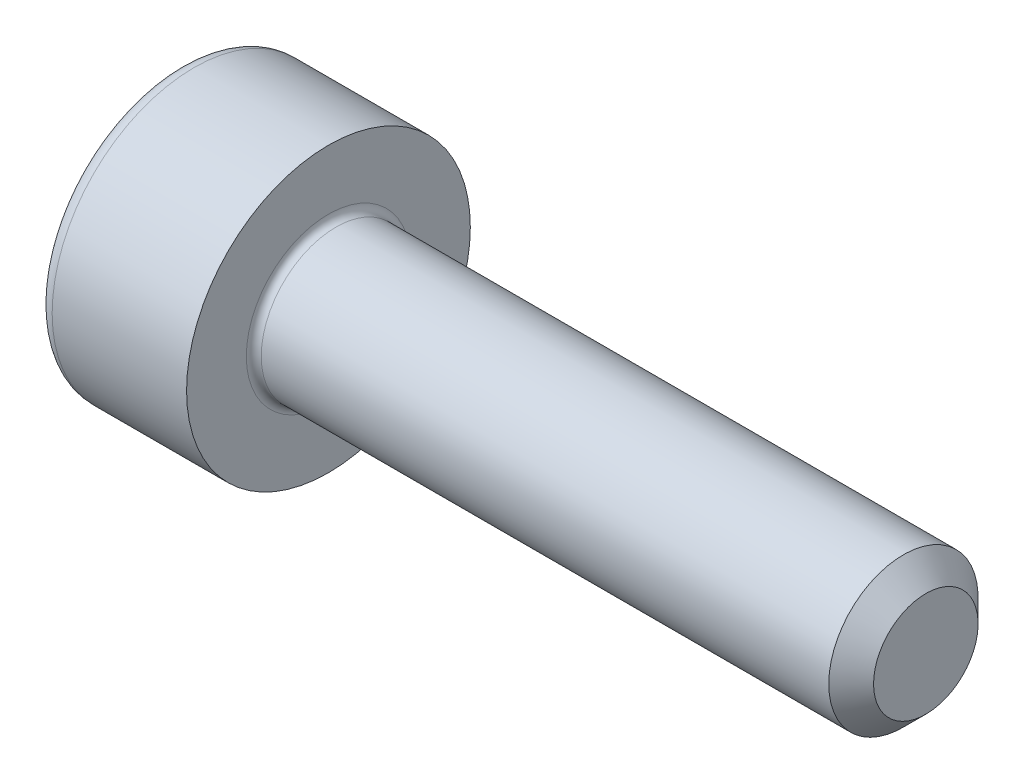
ISO-10303-21;
HEADER;
FILE_DESCRIPTION(('STEP AP214'),'2;1');
FILE_NAME('part.step','',(''),(''),'','','');
FILE_SCHEMA(('AUTOMOTIVE_DESIGN { 1 0 10303 214 1 1 1 1 }'));
ENDSEC;
DATA;
#1=APPLICATION_CONTEXT('core data for automotive mechanical design processes');
#2=APPLICATION_PROTOCOL_DEFINITION('international standard','automotive_design',2000,#1);
#3=PRODUCT_CONTEXT('',#1,'mechanical');
#4=PRODUCT('Part','Part','',(#3));
#5=PRODUCT_RELATED_PRODUCT_CATEGORY('part','',(#4));
#6=PRODUCT_DEFINITION_FORMATION('','',#4);
#7=PRODUCT_DEFINITION_CONTEXT('part definition',#1,'design');
#8=PRODUCT_DEFINITION('design','',#6,#7);
#9=PRODUCT_DEFINITION_SHAPE('','',#8);
#10=(LENGTH_UNIT() NAMED_UNIT(*) SI_UNIT(.MILLI.,.METRE.));
#11=(NAMED_UNIT(*) PLANE_ANGLE_UNIT() SI_UNIT($,.RADIAN.));
#12=(NAMED_UNIT(*) SI_UNIT($,.STERADIAN.) SOLID_ANGLE_UNIT());
#13=UNCERTAINTY_MEASURE_WITH_UNIT(LENGTH_MEASURE(1.E-05),#10,'distance_accuracy_value','');
#14=(GEOMETRIC_REPRESENTATION_CONTEXT(3) GLOBAL_UNCERTAINTY_ASSIGNED_CONTEXT((#13)) GLOBAL_UNIT_ASSIGNED_CONTEXT((#10,
#11,#12)) REPRESENTATION_CONTEXT('',''));
#15=CARTESIAN_POINT('',(0.,0.,0.));
#16=DIRECTION('',(0.,0.,1.));
#17=DIRECTION('',(1.,0.,0.));
#18=AXIS2_PLACEMENT_3D('',#15,#16,#17);
#19=CARTESIAN_POINT('',(-2.,0.,0.));
#20=DIRECTION('',(-1.,0.,0.));
#21=DIRECTION('',(0.,1.,0.));
#22=AXIS2_PLACEMENT_3D('',#19,#20,#21);
#23=PLANE('',#22);
#24=CARTESIAN_POINT('',(-2.,0.,0.));
#25=DIRECTION('',(1.,0.,0.));
#26=DIRECTION('',(0.,1.,0.));
#27=AXIS2_PLACEMENT_3D('',#24,#25,#26);
#28=CIRCLE('',#27,1.7);
#29=CARTESIAN_POINT('',(-2.,1.7,0.));
#30=VERTEX_POINT('',#29);
#31=EDGE_CURVE('E11',#30,#30,#28,.T.);
#32=ORIENTED_EDGE('',*,*,#31,.F.);
#33=EDGE_LOOP('',(#32));
#34=FACE_BOUND('',#33,.T.);
#35=DIRECTION('',(0.,0.500000000000005,-0.866025403784436));
#36=VECTOR('',#35,1.);
#37=CARTESIAN_POINT('',(-2.,0.433012701892217,0.750000000000003));
#38=LINE('',#37,#36);
#39=CARTESIAN_POINT('',(-2.,0.433012701892217,0.750000000000004));
#40=VERTEX_POINT('',#39);
#41=CARTESIAN_POINT('',(-2.,0.866025403784441,0.));
#42=VERTEX_POINT('',#41);
#43=EDGE_CURVE('E24',#40,#42,#38,.T.);
#44=ORIENTED_EDGE('',*,*,#43,.F.);
#45=DIRECTION('',(0.,1.,0.));
#46=VECTOR('',#45,1.);
#47=CARTESIAN_POINT('',(-2.,-0.433012701892221,0.750000000000003));
#48=LINE('',#47,#46);
#49=CARTESIAN_POINT('',(-2.,-0.433012701892221,0.750000000000003));
#50=VERTEX_POINT('',#49);
#51=EDGE_CURVE('E184',#50,#40,#48,.T.);
#52=ORIENTED_EDGE('',*,*,#51,.F.);
#53=DIRECTION('',(0.,0.499999999999999,0.866025403784439));
#54=VECTOR('',#53,1.);
#55=CARTESIAN_POINT('',(-2.,-0.86602540378444,0.));
#56=LINE('',#55,#54);
#57=CARTESIAN_POINT('',(-2.,-0.86602540378444,0.));
#58=VERTEX_POINT('',#57);
#59=EDGE_CURVE('E226',#58,#50,#56,.T.);
#60=ORIENTED_EDGE('',*,*,#59,.F.);
#61=DIRECTION('',(0.,-0.499999999999999,0.866025403784439));
#62=VECTOR('',#61,1.);
#63=CARTESIAN_POINT('',(-2.,-0.43301270189222,-0.750000000000001));
#64=LINE('',#63,#62);
#65=CARTESIAN_POINT('',(-2.,-0.433012701892221,-0.750000000000001));
#66=VERTEX_POINT('',#65);
#67=EDGE_CURVE('E133',#66,#58,#64,.T.);
#68=ORIENTED_EDGE('',*,*,#67,.F.);
#69=DIRECTION('',(0.,-1.,0.));
#70=VECTOR('',#69,1.);
#71=CARTESIAN_POINT('',(-2.,0.433012701892219,-0.749999999999998));
#72=LINE('',#71,#70);
#73=CARTESIAN_POINT('',(-2.,0.433012701892219,-0.749999999999998));
#74=VERTEX_POINT('',#73);
#75=EDGE_CURVE('E117',#74,#66,#72,.T.);
#76=ORIENTED_EDGE('',*,*,#75,.F.);
#77=DIRECTION('',(0.,-0.5,-0.866025403784439));
#78=VECTOR('',#77,1.);
#79=CARTESIAN_POINT('',(-2.,0.866025403784441,0.));
#80=LINE('',#79,#78);
#81=EDGE_CURVE('E111',#42,#74,#80,.T.);
#82=ORIENTED_EDGE('',*,*,#81,.F.);
#83=EDGE_LOOP('',(#44,#52,#60,#68,#76,#82));
#84=FACE_BOUND('',#83,.T.);
#85=ADVANCED_FACE('F17',(#34,#84),#23,.T.);
#86=CARTESIAN_POINT('',(-1.,0.,0.));
#87=DIRECTION('',(-1.,0.,0.));
#88=DIRECTION('',(0.,0.,1.));
#89=AXIS2_PLACEMENT_3D('',#86,#87,#88);
#90=CONICAL_SURFACE('',#89,0.866025403784438,1.0471975511966);
#91=CARTESIAN_POINT('',(-0.5,0.,0.));
#92=VERTEX_POINT('',#91);
#93=VERTEX_LOOP('',#92);
#94=FACE_BOUND('',#93,.T.);
#95=CARTESIAN_POINT('',(-0.933012701892204,0.,0.749999999999973));
#96=CARTESIAN_POINT('',(-0.933008833544879,0.0199213912756084,0.750000000000135));
#97=CARTESIAN_POINT('',(-0.933470994729893,0.0398405243523647,0.750000000000083));
#98=CARTESIAN_POINT('',(-0.935296784596608,0.0796264841816474,0.749999999999923));
#99=CARTESIAN_POINT('',(-0.936659909026974,0.0994933339552711,0.749999999999815));
#100=CARTESIAN_POINT('',(-0.94115593553694,0.149058236469928,0.749999999999938));
#101=CARTESIAN_POINT('',(-0.944832841581887,0.178707735224105,0.750000000000364));
#102=CARTESIAN_POINT('',(-0.953950481546132,0.237746808839611,0.749999999999642));
#103=CARTESIAN_POINT('',(-0.959392256286227,0.267136219783089,0.749999999998492));
#104=CARTESIAN_POINT('',(-0.970471226698135,0.319354671321508,0.749999999998111));
#105=CARTESIAN_POINT('',(-0.975819293302447,0.34224623989559,0.749999999998523));
#106=CARTESIAN_POINT('',(-0.987328994472387,0.387797508754008,0.750000000001483));
#107=CARTESIAN_POINT('',(-0.993489716114358,0.410457438925144,0.750000000004029));
#108=CARTESIAN_POINT('',(-1.,0.433012701878141,0.750000000008129));
#109=B_SPLINE_CURVE_WITH_KNOTS('',3,(#95,#96,#97,#98,#99,#100,#101,#102,#103,#104,#105,#106,
#107,#108),.UNSPECIFIED.,.F.,.F.,(4,2,2,2,2,2,4),(0.,0.059754808156758,0.119476201014601,
0.209043066262145,0.298662849379751,0.369171648737575,0.439601903682821),.UNSPECIFIED.);
#110=CARTESIAN_POINT('',(-0.933012701892221,0.,0.750000000000003));
#111=VERTEX_POINT('',#110);
#112=CARTESIAN_POINT('',(-0.999999999994507,0.433012701892217,0.750000000000004));
#113=VERTEX_POINT('',#112);
#114=EDGE_CURVE('E179',#111,#113,#109,.T.);
#115=ORIENTED_EDGE('',*,*,#114,.T.);
#116=CARTESIAN_POINT('',(-0.999999999997254,0.433012701887088,0.750000000002964));
#117=CARTESIAN_POINT('',(-0.993725594986995,0.44388203395943,0.731173764614613));
#118=CARTESIAN_POINT('',(-0.987775954947516,0.454799336624101,0.712264441718613));
#119=CARTESIAN_POINT('',(-0.976625475516025,0.476743748583125,0.674255605263011));
#120=CARTESIAN_POINT('',(-0.971425607529809,0.48777098088496,0.655155878648199));
#121=CARTESIAN_POINT('',(-0.959509689755132,0.515452172117026,0.607210649023551));
#122=CARTESIAN_POINT('',(-0.95333332833011,0.532165892430157,0.578261636265314));
#123=CARTESIAN_POINT('',(-0.943287736785978,0.565757815373363,0.520078718984595));
#124=CARTESIAN_POINT('',(-0.939417119088209,0.582635912853792,0.490844996586663));
#125=CARTESIAN_POINT('',(-0.933854884639651,0.619142178043651,0.427614290527316));
#126=CARTESIAN_POINT('',(-0.932598487714664,0.63878779243049,0.393587088350106));
#127=CARTESIAN_POINT('',(-0.933670888553846,0.678054088190912,0.325575868879079));
#128=CARTESIAN_POINT('',(-0.936000004780061,0.69767476719484,0.29159185568959));
#129=CARTESIAN_POINT('',(-0.94689156440335,0.750725165162678,0.19970586964693));
#130=CARTESIAN_POINT('',(-0.958722645304518,0.783985416881427,0.142097422205928));
#131=CARTESIAN_POINT('',(-0.981909295146268,0.833330188524845,0.0566297714484034));
#132=CARTESIAN_POINT('',(-0.990586361201697,0.849746087684786,0.0281966008665968));
#133=CARTESIAN_POINT('',(-0.999999999999389,0.86602540378444,-1.07214963685674E-11));
#134=B_SPLINE_CURVE_WITH_KNOTS('',3,(#116,#117,#118,#119,#120,#121,#122,#123,#124,#125,#126,
#127,#128,#129,#130,#131,#132,#133),.UNSPECIFIED.,.F.,.F.,(4,2,2,2,2,2,2,2,4),(0.,
0.0678778965122259,0.135842960401226,0.237750158057644,0.339595966637661,0.457362799036722,
0.575140091983207,0.77723010535451,0.879016706592094),.UNSPECIFIED.);
#135=CARTESIAN_POINT('',(-0.999999999998778,0.866025403784441,0.));
#136=VERTEX_POINT('',#135);
#137=EDGE_CURVE('E165',#113,#136,#134,.T.);
#138=ORIENTED_EDGE('',*,*,#137,.T.);
#139=CARTESIAN_POINT('',(-0.999999999999389,0.86602540378444,-1.9263149996095E-12));
#140=CARTESIAN_POINT('',(-0.993725594987899,0.855156071716782,-0.0188262353877419));
#141=CARTESIAN_POINT('',(-0.987775954948481,0.844238769054009,-0.0377355582799994));
#142=CARTESIAN_POINT('',(-0.976625475518107,0.82229435709808,-0.0757443947279822));
#143=CARTESIAN_POINT('',(-0.971425607532947,0.811267124797441,-0.0948441213389177));
#144=CARTESIAN_POINT('',(-0.959509689759815,0.783585933572798,-0.142789350957965));
#145=CARTESIAN_POINT('',(-0.953333328334982,0.766872213268472,-0.171738363715886));
#146=CARTESIAN_POINT('',(-0.943287736790654,0.733280290313264,-0.229921280978897));
#147=CARTESIAN_POINT('',(-0.939417119092502,0.716402192812047,-0.259155003359448));
#148=CARTESIAN_POINT('',(-0.933854884641243,0.679895927658915,-0.322385709443386));
#149=CARTESIAN_POINT('',(-0.93259848771494,0.660250313343309,-0.356412911670596));
#150=CARTESIAN_POINT('',(-0.933670888552937,0.620984017411546,-0.424424131060475));
#151=CARTESIAN_POINT('',(-0.936000004779282,0.601363338165015,-0.458408144118799));
#152=CARTESIAN_POINT('',(-0.94689156440336,0.548312938980402,-0.550294129467752));
#153=CARTESIAN_POINT('',(-0.958722645304526,0.5150526858833,-0.60790257611293));
#154=CARTESIAN_POINT('',(-0.981909295146271,0.465707914947231,-0.693370227278804));
#155=CARTESIAN_POINT('',(-0.990586361201698,0.449292016493224,-0.721803398268172));
#156=CARTESIAN_POINT('',(-0.999999999999388,0.433012701882926,-0.750000000005365));
#157=B_SPLINE_CURVE_WITH_KNOTS('',3,(#139,#140,#141,#142,#143,#144,#145,#146,#147,#148,#149,
#150,#151,#152,#153,#154,#155,#156),.UNSPECIFIED.,.F.,.F.,(4,2,2,2,2,2,2,2,4),(0.,
0.0678778965000533,0.135842960376759,0.237750158019345,0.339595966585644,0.457362799007784,
0.575140091977281,0.777230105348513,0.879016706586076),.UNSPECIFIED.);
#158=CARTESIAN_POINT('',(-0.999999999998775,0.433012701892219,-0.749999999999998));
#159=VERTEX_POINT('',#158);
#160=EDGE_CURVE('E151',#136,#159,#157,.T.);
#161=ORIENTED_EDGE('',*,*,#160,.T.);
#162=CARTESIAN_POINT('',(-0.999999999999388,0.433012701890549,-0.750000000000963));
#163=CARTESIAN_POINT('',(-0.9937255949879,0.411274037754983,-0.750000000001111));
#164=CARTESIAN_POINT('',(-0.987775954948483,0.389439432430544,-0.750000000000475));
#165=CARTESIAN_POINT('',(-0.976625475518111,0.345550608520348,-0.749999999999521));
#166=CARTESIAN_POINT('',(-0.971425607532951,0.323496143919626,-0.749999999999203));
#167=CARTESIAN_POINT('',(-0.959509689759821,0.268133761466942,-0.750000000001171));
#168=CARTESIAN_POINT('',(-0.953333328334989,0.234706320851946,-0.750000000004837));
#169=CARTESIAN_POINT('',(-0.943287736790661,0.1675224749583,-0.749999999995164));
#170=CARTESIAN_POINT('',(-0.939417119092509,0.133766279978958,-0.749999999981834));
#171=CARTESIAN_POINT('',(-0.933854884641246,0.0607537496344794,-0.750000000003901));
#172=CARTESIAN_POINT('',(-0.932598487714941,0.0214625209281991,-0.75000000004724));
#173=CARTESIAN_POINT('',(-0.933670888552935,-0.0570700707716807,-0.749999999952755));
#174=CARTESIAN_POINT('',(-0.936000004779278,-0.0963114290259993,-0.749999999814915));
#175=CARTESIAN_POINT('',(-0.946891564403355,-0.202412226182275,-0.749999999114611));
#176=CARTESIAN_POINT('',(-0.95872264530452,-0.268932730998118,-0.749999998318811));
#177=CARTESIAN_POINT('',(-0.981909295146268,-0.367622273577602,-0.749999998727188));
#178=CARTESIAN_POINT('',(-0.990586361201696,-0.400454071191554,-0.749999999134757));
#179=CARTESIAN_POINT('',(-0.999999999999388,-0.433012701901512,-0.749999999994636));
#180=B_SPLINE_CURVE_WITH_KNOTS('',3,(#162,#163,#164,#165,#166,#167,#168,#169,#170,#171,#172,
#173,#174,#175,#176,#177,#178,#179),.UNSPECIFIED.,.F.,.F.,(4,2,2,2,2,2,2,2,4),(0.,
0.0678778965000383,0.135842960376729,0.237750158019295,0.339595966585576,0.457362799007724,
0.575140091977229,0.777230105348485,0.879016706586073),.UNSPECIFIED.);
#181=CARTESIAN_POINT('',(-0.999999999998777,-0.433012701892221,-0.750000000000001));
#182=VERTEX_POINT('',#181);
#183=EDGE_CURVE('E126',#159,#182,#180,.T.);
#184=ORIENTED_EDGE('',*,*,#183,.T.);
#185=CARTESIAN_POINT('',(-0.999999999999388,-0.433012701893893,-0.749999999999034));
#186=CARTESIAN_POINT('',(-0.993725594987898,-0.443882033961809,-0.731173764613362));
#187=CARTESIAN_POINT('',(-0.987775954948478,-0.454799336623482,-0.712264441720464));
#188=CARTESIAN_POINT('',(-0.976625475518102,-0.476743748577763,-0.674255605271519));
#189=CARTESIAN_POINT('',(-0.971425607532941,-0.487770980877854,-0.655155878660261));
#190=CARTESIAN_POINT('',(-0.959509689759808,-0.515452172105912,-0.607210649043171));
#191=CARTESIAN_POINT('',(-0.953333328334974,-0.532165892416592,-0.578261636288909));
#192=CARTESIAN_POINT('',(-0.943287736790646,-0.565757815355052,-0.52007871901621));
#193=CARTESIAN_POINT('',(-0.939417119092496,-0.582635912833186,-0.490844996622323));
#194=CARTESIAN_POINT('',(-0.933854884641239,-0.619142178024548,-0.427614290560433));
#195=CARTESIAN_POINT('',(-0.932598487714939,-0.638787792415225,-0.393587088376551));
#196=CARTESIAN_POINT('',(-0.933670888552943,-0.678054088183349,-0.325575868892165));
#197=CARTESIAN_POINT('',(-0.936000004779293,-0.69767476719114,-0.291591855695991));
#198=CARTESIAN_POINT('',(-0.946891564403382,-0.750725165162782,-0.199705869646749));
#199=CARTESIAN_POINT('',(-0.958722645304547,-0.783985416881501,-0.142097422205796));
#200=CARTESIAN_POINT('',(-0.981909295146284,-0.833330188524874,-0.0566297714483446));
#201=CARTESIAN_POINT('',(-0.990586361201705,-0.849746087684799,-0.0281966008665637));
#202=CARTESIAN_POINT('',(-0.999999999999388,-0.866025403784439,1.07311981421065E-11));
#203=B_SPLINE_CURVE_WITH_KNOTS('',3,(#185,#186,#187,#188,#189,#190,#191,#192,#193,#194,#195,
#196,#197,#198,#199,#200,#201,#202),.UNSPECIFIED.,.F.,.F.,(4,2,2,2,2,2,2,2,4),(0.,
0.0678778965000681,0.135842960376788,0.237750158019398,0.339595966585721,0.457362799007898,
0.575140091977433,0.777230105348577,0.879016706586072),.UNSPECIFIED.);
#204=CARTESIAN_POINT('',(-0.999999999998777,-0.86602540378444,0.));
#205=VERTEX_POINT('',#204);
#206=EDGE_CURVE('E158',#182,#205,#203,.T.);
#207=ORIENTED_EDGE('',*,*,#206,.T.);
#208=CARTESIAN_POINT('',(-0.999999999999388,-0.866025403784439,1.93411096122033E-12));
#209=CARTESIAN_POINT('',(-0.9937255949879,-0.855156071716783,0.0188262353877477));
#210=CARTESIAN_POINT('',(-0.987775954948482,-0.844238769054011,0.0377355582800032));
#211=CARTESIAN_POINT('',(-0.976625475518109,-0.822294357098084,0.0757443947279829));
#212=CARTESIAN_POINT('',(-0.971425607532949,-0.811267124797445,0.0948441213389174));
#213=CARTESIAN_POINT('',(-0.959509689759818,-0.783585933572804,0.142789350957962));
#214=CARTESIAN_POINT('',(-0.953333328334986,-0.766872213268478,0.171738363715882));
#215=CARTESIAN_POINT('',(-0.943287736790656,-0.733280290313272,0.22992128097889));
#216=CARTESIAN_POINT('',(-0.939417119092502,-0.716402192812056,0.259155003359439));
#217=CARTESIAN_POINT('',(-0.93385488464125,-0.679895927658923,0.322385709443379));
#218=CARTESIAN_POINT('',(-0.932598487714961,-0.660250313343315,0.356412911670594));
#219=CARTESIAN_POINT('',(-0.93367088855292,-0.620984017411546,0.424424131060482));
#220=CARTESIAN_POINT('',(-0.93600000477921,-0.601363338165012,0.458408144118811));
#221=CARTESIAN_POINT('',(-0.946891564403489,-0.548312938980411,0.550294129467742));
#222=CARTESIAN_POINT('',(-0.95872264530516,-0.515052685883359,0.607902576112836));
#223=CARTESIAN_POINT('',(-0.981909295145933,-0.465707914947253,0.693370227278773));
#224=CARTESIAN_POINT('',(-0.990586361200703,-0.449292016493269,0.721803398268102));
#225=CARTESIAN_POINT('',(-0.999999999997254,-0.43301270188293,0.750000000005365));
#226=B_SPLINE_CURVE_WITH_KNOTS('',3,(#208,#209,#210,#211,#212,#213,#214,#215,#216,#217,#218,
#219,#220,#221,#222,#223,#224,#225),.UNSPECIFIED.,.F.,.F.,(4,2,2,2,2,2,2,2,4),(0.,
0.0678778965000461,0.135842960376748,0.237750158019329,0.33959596658562,0.457362799007785,
0.575140091977258,0.777230105348594,0.879016706585525),.UNSPECIFIED.);
#227=CARTESIAN_POINT('',(-0.999999999994508,-0.433012701892221,0.750000000000003));
#228=VERTEX_POINT('',#227);
#229=EDGE_CURVE('E172',#205,#228,#226,.T.);
#230=ORIENTED_EDGE('',*,*,#229,.T.);
#231=CARTESIAN_POINT('',(-0.999999999997254,-0.433012701878144,0.750000000008128));
#232=CARTESIAN_POINT('',(-0.990556996500291,-0.400285242719805,0.750000000002961));
#233=CARTESIAN_POINT('',(-0.981842849756315,-0.367328249887462,0.750000000000806));
#234=CARTESIAN_POINT('',(-0.96628677907055,-0.301139660804241,0.749999999999203));
#235=CARTESIAN_POINT('',(-0.959436379461823,-0.267910040547365,0.749999999999742));
#236=CARTESIAN_POINT('',(-0.947036724027862,-0.195879816811318,0.750000000000258));
#237=CARTESIAN_POINT('',(-0.941853350505028,-0.157013533752798,0.750000000000135));
#238=CARTESIAN_POINT('',(-0.934806333523548,-0.0787766988136589,0.74999999999987));
#239=CARTESIAN_POINT('',(-0.932960632852675,-0.039404560661845,0.749999999999728));
#240=CARTESIAN_POINT('',(-0.933012701892204,0.,0.749999999999973));
#241=B_SPLINE_CURVE_WITH_KNOTS('',3,(#231,#232,#233,#234,#235,#236,#237,#238,#239,#240),
.UNSPECIFIED.,.F.,.F.,(4,2,2,2,4),(0.,0.102205558125607,0.203938242263253,0.321428325826841,
0.439548160359031),.UNSPECIFIED.);
#242=EDGE_CURVE('E183',#228,#111,#241,.T.);
#243=ORIENTED_EDGE('',*,*,#242,.T.);
#244=EDGE_LOOP('',(#115,#138,#161,#184,#207,#230,#243));
#245=FACE_BOUND('',#244,.T.);
#246=ADVANCED_FACE('F139',(#94,#245),#90,.F.);
#247=CARTESIAN_POINT('',(0.5,-0.433012701892221,0.750000000000003));
#248=DIRECTION('',(0.,0.,1.));
#249=DIRECTION('',(0.,1.,0.));
#250=AXIS2_PLACEMENT_3D('',#247,#248,#249);
#251=PLANE('',#250);
#252=ORIENTED_EDGE('',*,*,#242,.F.);
#253=DIRECTION('',(-1.,0.,0.));
#254=VECTOR('',#253,1.);
#255=CARTESIAN_POINT('',(-0.999999999994508,-0.433012701892221,0.750000000000003));
#256=LINE('',#255,#254);
#257=EDGE_CURVE('E222',#228,#50,#256,.T.);
#258=ORIENTED_EDGE('',*,*,#257,.T.);
#259=ORIENTED_EDGE('',*,*,#51,.T.);
#260=DIRECTION('',(-1.,0.,0.));
#261=VECTOR('',#260,1.);
#262=CARTESIAN_POINT('',(-0.999999999994507,0.433012701892217,0.750000000000004));
#263=LINE('',#262,#261);
#264=EDGE_CURVE('E120',#113,#40,#263,.T.);
#265=ORIENTED_EDGE('',*,*,#264,.F.);
#266=ORIENTED_EDGE('',*,*,#114,.F.);
#267=EDGE_LOOP('',(#252,#258,#259,#265,#266));
#268=FACE_BOUND('',#267,.T.);
#269=ADVANCED_FACE('F143',(#268),#251,.F.);
#270=CARTESIAN_POINT('',(0.5,-0.86602540378444,0.));
#271=DIRECTION('',(0.,-0.866025403784439,0.5));
#272=DIRECTION('',(0.,0.5,0.866025403784439));
#273=AXIS2_PLACEMENT_3D('',#270,#271,#272);
#274=PLANE('',#273);
#275=ORIENTED_EDGE('',*,*,#229,.F.);
#276=DIRECTION('',(-1.,0.,0.));
#277=VECTOR('',#276,1.);
#278=CARTESIAN_POINT('',(-0.999999999998777,-0.86602540378444,0.));
#279=LINE('',#278,#277);
#280=EDGE_CURVE('E229',#205,#58,#279,.T.);
#281=ORIENTED_EDGE('',*,*,#280,.T.);
#282=ORIENTED_EDGE('',*,*,#59,.T.);
#283=ORIENTED_EDGE('',*,*,#257,.F.);
#284=EDGE_LOOP('',(#275,#281,#282,#283));
#285=FACE_BOUND('',#284,.T.);
#286=ADVANCED_FACE('F190',(#285),#274,.F.);
#287=CARTESIAN_POINT('',(0.5,-0.433012701892221,-0.750000000000001));
#288=DIRECTION('',(0.,-0.866025403784439,-0.499999999999999));
#289=DIRECTION('',(0.,-0.499999999999999,0.866025403784439));
#290=AXIS2_PLACEMENT_3D('',#287,#288,#289);
#291=PLANE('',#290);
#292=ORIENTED_EDGE('',*,*,#206,.F.);
#293=DIRECTION('',(-1.,0.,0.));
#294=VECTOR('',#293,1.);
#295=CARTESIAN_POINT('',(-0.999999999998777,-0.433012701892221,-0.750000000000001));
#296=LINE('',#295,#294);
#297=EDGE_CURVE('E123',#182,#66,#296,.T.);
#298=ORIENTED_EDGE('',*,*,#297,.T.);
#299=ORIENTED_EDGE('',*,*,#67,.T.);
#300=ORIENTED_EDGE('',*,*,#280,.F.);
#301=EDGE_LOOP('',(#292,#298,#299,#300));
#302=FACE_BOUND('',#301,.T.);
#303=ADVANCED_FACE('F201',(#302),#291,.F.);
#304=CARTESIAN_POINT('',(0.5,0.433012701892219,-0.749999999999998));
#305=DIRECTION('',(0.,0.,-1.));
#306=DIRECTION('',(0.,-1.,0.));
#307=AXIS2_PLACEMENT_3D('',#304,#305,#306);
#308=PLANE('',#307);
#309=ORIENTED_EDGE('',*,*,#183,.F.);
#310=DIRECTION('',(-1.,0.,0.));
#311=VECTOR('',#310,1.);
#312=CARTESIAN_POINT('',(-0.999999999998775,0.433012701892219,-0.749999999999998));
#313=LINE('',#312,#311);
#314=EDGE_CURVE('E114',#159,#74,#313,.T.);
#315=ORIENTED_EDGE('',*,*,#314,.T.);
#316=ORIENTED_EDGE('',*,*,#75,.T.);
#317=ORIENTED_EDGE('',*,*,#297,.F.);
#318=EDGE_LOOP('',(#309,#315,#316,#317));
#319=FACE_BOUND('',#318,.T.);
#320=ADVANCED_FACE('F135',(#319),#308,.F.);
#321=CARTESIAN_POINT('',(0.5,0.866025403784441,0.));
#322=DIRECTION('',(0.,0.866025403784439,-0.5));
#323=DIRECTION('',(0.,-0.5,-0.866025403784439));
#324=AXIS2_PLACEMENT_3D('',#321,#322,#323);
#325=PLANE('',#324);
#326=ORIENTED_EDGE('',*,*,#160,.F.);
#327=DIRECTION('',(-1.,0.,0.));
#328=VECTOR('',#327,1.);
#329=CARTESIAN_POINT('',(-0.999999999998778,0.866025403784441,0.));
#330=LINE('',#329,#328);
#331=EDGE_CURVE('E108',#136,#42,#330,.T.);
#332=ORIENTED_EDGE('',*,*,#331,.T.);
#333=ORIENTED_EDGE('',*,*,#81,.T.);
#334=ORIENTED_EDGE('',*,*,#314,.F.);
#335=EDGE_LOOP('',(#326,#332,#333,#334));
#336=FACE_BOUND('',#335,.T.);
#337=ADVANCED_FACE('F197',(#336),#325,.F.);
#338=CARTESIAN_POINT('',(0.5,0.433012701892217,0.750000000000004));
#339=DIRECTION('',(0.,0.866025403784436,0.500000000000005));
#340=DIRECTION('',(0.,0.500000000000005,-0.866025403784436));
#341=AXIS2_PLACEMENT_3D('',#338,#339,#340);
#342=PLANE('',#341);
#343=ORIENTED_EDGE('',*,*,#137,.F.);
#344=ORIENTED_EDGE('',*,*,#264,.T.);
#345=ORIENTED_EDGE('',*,*,#43,.T.);
#346=ORIENTED_EDGE('',*,*,#331,.F.);
#347=EDGE_LOOP('',(#343,#344,#345,#346));
#348=FACE_BOUND('',#347,.T.);
#349=ADVANCED_FACE('F192',(#348),#342,.F.);
#350=CARTESIAN_POINT('',(-2.,0.,0.));
#351=DIRECTION('',(1.,0.,0.));
#352=DIRECTION('',(0.,1.,0.));
#353=AXIS2_PLACEMENT_3D('',#350,#351,#352);
#354=CYLINDRICAL_SURFACE('',#353,1.9);
#355=CARTESIAN_POINT('',(0.,0.,0.));
#356=DIRECTION('',(1.,0.,0.));
#357=DIRECTION('',(0.,1.,0.));
#358=AXIS2_PLACEMENT_3D('',#355,#356,#357);
#359=CIRCLE('',#358,1.9);
#360=CARTESIAN_POINT('',(0.,1.9,0.));
#361=VERTEX_POINT('',#360);
#362=EDGE_CURVE('E105',#361,#361,#359,.T.);
#363=ORIENTED_EDGE('',*,*,#362,.F.);
#364=EDGE_LOOP('',(#363));
#365=FACE_BOUND('',#364,.T.);
#366=CARTESIAN_POINT('',(-1.8,0.,0.));
#367=DIRECTION('',(1.,0.,0.));
#368=DIRECTION('',(0.,1.,0.));
#369=AXIS2_PLACEMENT_3D('',#366,#367,#368);
#370=CIRCLE('',#369,1.9);
#371=CARTESIAN_POINT('',(-1.8,1.9,0.));
#372=VERTEX_POINT('',#371);
#373=EDGE_CURVE('E103',#372,#372,#370,.T.);
#374=ORIENTED_EDGE('',*,*,#373,.T.);
#375=EDGE_LOOP('',(#374));
#376=FACE_BOUND('',#375,.T.);
#377=ADVANCED_FACE('F196',(#365,#376),#354,.T.);
#378=CARTESIAN_POINT('',(0.,0.,0.));
#379=DIRECTION('',(1.,0.,0.));
#380=DIRECTION('',(0.,1.,0.));
#381=AXIS2_PLACEMENT_3D('',#378,#379,#380);
#382=PLANE('',#381);
#383=ORIENTED_EDGE('',*,*,#362,.T.);
#384=EDGE_LOOP('',(#383));
#385=FACE_BOUND('',#384,.T.);
#386=CARTESIAN_POINT('',(0.,0.,0.));
#387=DIRECTION('',(1.,0.,0.));
#388=DIRECTION('',(0.,0.,1.));
#389=AXIS2_PLACEMENT_3D('',#386,#387,#388);
#390=CIRCLE('',#389,1.1);
#391=CARTESIAN_POINT('',(0.,0.,1.1));
#392=VERTEX_POINT('',#391);
#393=EDGE_CURVE('E95',#392,#392,#390,.T.);
#394=ORIENTED_EDGE('',*,*,#393,.F.);
#395=EDGE_LOOP('',(#394));
#396=FACE_BOUND('',#395,.T.);
#397=ADVANCED_FACE('F244',(#385,#396),#382,.T.);
#398=CARTESIAN_POINT('',(0.,0.,0.));
#399=DIRECTION('',(1.,0.,0.));
#400=DIRECTION('',(0.,0.,1.));
#401=AXIS2_PLACEMENT_3D('',#398,#399,#400);
#402=CYLINDRICAL_SURFACE('',#401,1.);
#403=CARTESIAN_POINT('',(7.7,0.,0.));
#404=DIRECTION('',(1.,0.,0.));
#405=DIRECTION('',(0.,0.,1.));
#406=AXIS2_PLACEMENT_3D('',#403,#404,#405);
#407=CIRCLE('',#406,1.);
#408=CARTESIAN_POINT('',(7.7,0.,1.));
#409=VERTEX_POINT('',#408);
#410=EDGE_CURVE('E100',#409,#409,#407,.T.);
#411=ORIENTED_EDGE('',*,*,#410,.F.);
#412=EDGE_LOOP('',(#411));
#413=FACE_BOUND('',#412,.T.);
#414=CARTESIAN_POINT('',(0.1,0.,0.));
#415=DIRECTION('',(1.,0.,0.));
#416=DIRECTION('',(0.,0.,1.));
#417=AXIS2_PLACEMENT_3D('',#414,#415,#416);
#418=CIRCLE('',#417,1.);
#419=CARTESIAN_POINT('',(0.1,0.,1.));
#420=VERTEX_POINT('',#419);
#421=EDGE_CURVE('E89',#420,#420,#418,.T.);
#422=ORIENTED_EDGE('',*,*,#421,.T.);
#423=EDGE_LOOP('',(#422));
#424=FACE_BOUND('',#423,.T.);
#425=ADVANCED_FACE('F90',(#413,#424),#402,.T.);
#426=CARTESIAN_POINT('',(7.7,0.,0.));
#427=DIRECTION('',(-1.,0.,0.));
#428=DIRECTION('',(0.,0.,1.));
#429=AXIS2_PLACEMENT_3D('',#426,#427,#428);
#430=CONICAL_SURFACE('',#429,1.,0.785398163397449);
#431=CARTESIAN_POINT('',(8.,0.,0.));
#432=DIRECTION('',(1.,0.,0.));
#433=DIRECTION('',(0.,0.,1.));
#434=AXIS2_PLACEMENT_3D('',#431,#432,#433);
#435=CIRCLE('',#434,0.7);
#436=CARTESIAN_POINT('',(8.,0.,0.7));
#437=VERTEX_POINT('',#436);
#438=EDGE_CURVE('E92',#437,#437,#435,.T.);
#439=ORIENTED_EDGE('',*,*,#438,.F.);
#440=EDGE_LOOP('',(#439));
#441=FACE_BOUND('',#440,.T.);
#442=ORIENTED_EDGE('',*,*,#410,.T.);
#443=EDGE_LOOP('',(#442));
#444=FACE_BOUND('',#443,.T.);
#445=ADVANCED_FACE('F251',(#441,#444),#430,.T.);
#446=CARTESIAN_POINT('',(8.,0.,0.));
#447=DIRECTION('',(1.,0.,0.));
#448=DIRECTION('',(0.,0.,1.));
#449=AXIS2_PLACEMENT_3D('',#446,#447,#448);
#450=PLANE('',#449);
#451=ORIENTED_EDGE('',*,*,#438,.T.);
#452=EDGE_LOOP('',(#451));
#453=FACE_BOUND('',#452,.T.);
#454=ADVANCED_FACE('F255',(#453),#450,.T.);
#455=CARTESIAN_POINT('',(-1.8,0.,0.));
#456=DIRECTION('',(1.,0.,0.));
#457=DIRECTION('',(0.,1.,0.));
#458=AXIS2_PLACEMENT_3D('',#455,#456,#457);
#459=TOROIDAL_SURFACE('',#458,1.7,0.2);
#460=ORIENTED_EDGE('',*,*,#373,.F.);
#461=EDGE_LOOP('',(#460));
#462=FACE_BOUND('',#461,.T.);
#463=ORIENTED_EDGE('',*,*,#31,.T.);
#464=EDGE_LOOP('',(#463));
#465=FACE_BOUND('',#464,.T.);
#466=ADVANCED_FACE('F144',(#462,#465),#459,.T.);
#467=CARTESIAN_POINT('',(0.1,0.,0.));
#468=DIRECTION('',(1.,0.,0.));
#469=DIRECTION('',(0.,0.,1.));
#470=AXIS2_PLACEMENT_3D('',#467,#468,#469);
#471=TOROIDAL_SURFACE('',#470,1.1,0.1);
#472=ORIENTED_EDGE('',*,*,#421,.F.);
#473=EDGE_LOOP('',(#472));
#474=FACE_BOUND('',#473,.T.);
#475=ORIENTED_EDGE('',*,*,#393,.T.);
#476=EDGE_LOOP('',(#475));
#477=FACE_BOUND('',#476,.T.);
#478=ADVANCED_FACE('F257',(#474,#477),#471,.F.);
#479=CLOSED_SHELL('',(#85,#246,#269,#286,#303,#320,#337,#349,#377,#397,#425,#445,#454,#466,#478));
#480=MANIFOLD_SOLID_BREP('B1',#479);
#481=ADVANCED_BREP_SHAPE_REPRESENTATION('',(#18,#480),#14);
#482=SHAPE_DEFINITION_REPRESENTATION(#9,#481);
ENDSEC;
END-ISO-10303-21;
